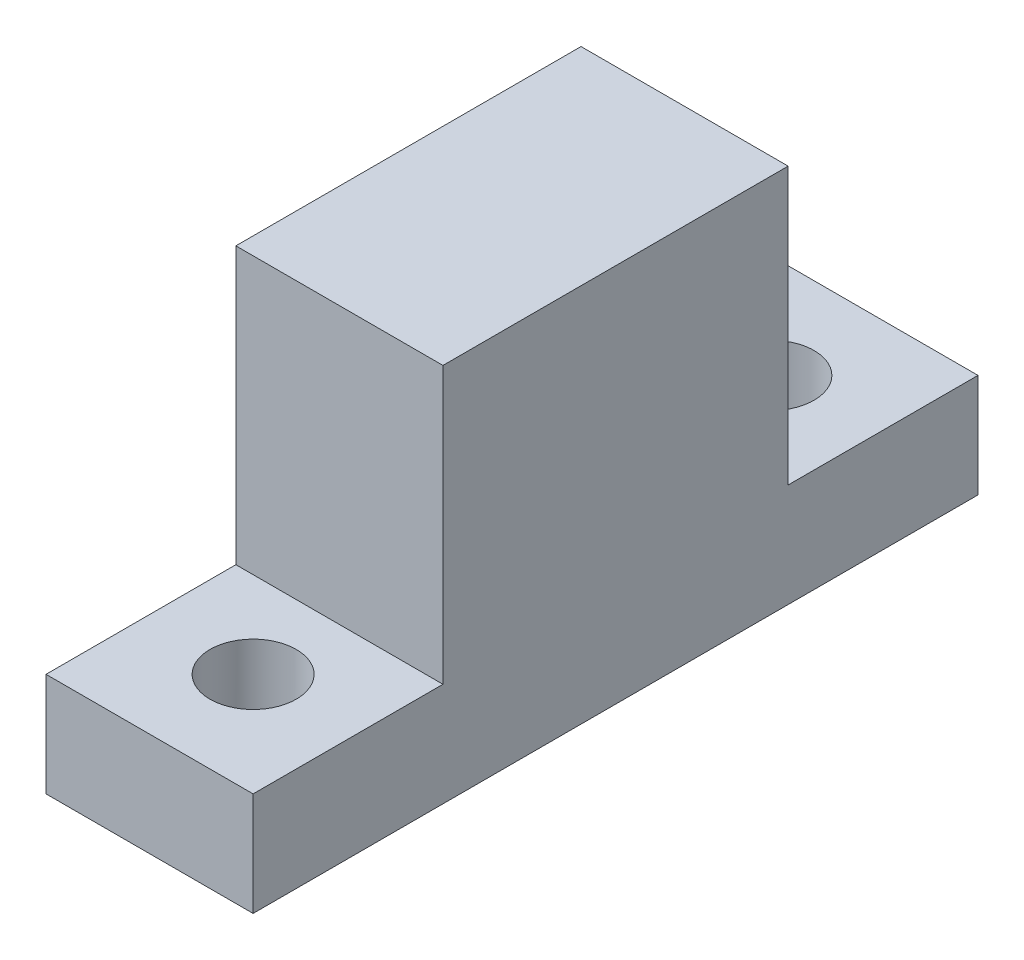
ISO-10303-21;
HEADER;
FILE_DESCRIPTION(('STEP AP214'),'2;1');
FILE_NAME('part.step','',(''),(''),'','','');
FILE_SCHEMA(('AUTOMOTIVE_DESIGN { 1 0 10303 214 1 1 1 1 }'));
ENDSEC;
DATA;
#1=APPLICATION_CONTEXT('core data for automotive mechanical design processes');
#2=APPLICATION_PROTOCOL_DEFINITION('international standard','automotive_design',2000,#1);
#3=PRODUCT_CONTEXT('',#1,'mechanical');
#4=PRODUCT('Part','Part','',(#3));
#5=PRODUCT_RELATED_PRODUCT_CATEGORY('part','',(#4));
#6=PRODUCT_DEFINITION_FORMATION('','',#4);
#7=PRODUCT_DEFINITION_CONTEXT('part definition',#1,'design');
#8=PRODUCT_DEFINITION('design','',#6,#7);
#9=PRODUCT_DEFINITION_SHAPE('','',#8);
#10=(LENGTH_UNIT() NAMED_UNIT(*) SI_UNIT(.MILLI.,.METRE.));
#11=(NAMED_UNIT(*) PLANE_ANGLE_UNIT() SI_UNIT($,.RADIAN.));
#12=(NAMED_UNIT(*) SI_UNIT($,.STERADIAN.) SOLID_ANGLE_UNIT());
#13=UNCERTAINTY_MEASURE_WITH_UNIT(LENGTH_MEASURE(1.E-05),#10,'distance_accuracy_value','');
#14=(GEOMETRIC_REPRESENTATION_CONTEXT(3) GLOBAL_UNCERTAINTY_ASSIGNED_CONTEXT((#13)) GLOBAL_UNIT_ASSIGNED_CONTEXT((#10,
#11,#12)) REPRESENTATION_CONTEXT('',''));
#15=CARTESIAN_POINT('',(0.,0.,0.));
#16=DIRECTION('',(0.,0.,1.));
#17=DIRECTION('',(1.,0.,0.));
#18=AXIS2_PLACEMENT_3D('',#15,#16,#17);
#19=CARTESIAN_POINT('',(0.,3.,0.));
#20=DIRECTION('',(0.,-1.,0.));
#21=DIRECTION('',(0.,0.,-1.));
#22=AXIS2_PLACEMENT_3D('',#19,#20,#21);
#23=PLANE('',#22);
#24=CARTESIAN_POINT('',(3.,3.,-18.));
#25=DIRECTION('',(0.,1.,0.));
#26=DIRECTION('',(0.,0.,1.));
#27=AXIS2_PLACEMENT_3D('',#24,#25,#26);
#28=CIRCLE('',#27,1.25);
#29=CARTESIAN_POINT('',(3.,3.,-16.75));
#30=VERTEX_POINT('',#29);
#31=EDGE_CURVE('E177',#30,#30,#28,.T.);
#32=ORIENTED_EDGE('',*,*,#31,.F.);
#33=EDGE_LOOP('',(#32));
#34=FACE_BOUND('',#33,.T.);
#35=DIRECTION('',(-1.,0.,0.));
#36=VECTOR('',#35,1.);
#37=CARTESIAN_POINT('',(0.,3.,-15.5));
#38=LINE('',#37,#36);
#39=CARTESIAN_POINT('',(6.,3.,-15.5));
#40=VERTEX_POINT('',#39);
#41=CARTESIAN_POINT('',(0.,3.,-15.5));
#42=VERTEX_POINT('',#41);
#43=EDGE_CURVE('E57',#40,#42,#38,.T.);
#44=ORIENTED_EDGE('',*,*,#43,.F.);
#45=DIRECTION('',(0.,0.,-1.));
#46=VECTOR('',#45,1.);
#47=CARTESIAN_POINT('',(6.,3.,0.));
#48=LINE('',#47,#46);
#49=CARTESIAN_POINT('',(6.,3.,-21.));
#50=VERTEX_POINT('',#49);
#51=EDGE_CURVE('E149',#40,#50,#48,.T.);
#52=ORIENTED_EDGE('',*,*,#51,.T.);
#53=DIRECTION('',(-1.,0.,0.));
#54=VECTOR('',#53,1.);
#55=CARTESIAN_POINT('',(0.,3.,-21.));
#56=LINE('',#55,#54);
#57=CARTESIAN_POINT('',(0.,3.,-21.));
#58=VERTEX_POINT('',#57);
#59=EDGE_CURVE('E153',#50,#58,#56,.T.);
#60=ORIENTED_EDGE('',*,*,#59,.T.);
#61=DIRECTION('',(0.,0.,1.));
#62=VECTOR('',#61,1.);
#63=CARTESIAN_POINT('',(0.,3.,0.));
#64=LINE('',#63,#62);
#65=EDGE_CURVE('E143',#58,#42,#64,.T.);
#66=ORIENTED_EDGE('',*,*,#65,.T.);
#67=EDGE_LOOP('',(#44,#52,#60,#66));
#68=FACE_BOUND('',#67,.T.);
#69=ADVANCED_FACE('F39',(#34,#68),#23,.F.);
#70=CARTESIAN_POINT('',(3.,3.,-3.));
#71=DIRECTION('',(0.,1.,0.));
#72=DIRECTION('',(0.,0.,1.));
#73=AXIS2_PLACEMENT_3D('',#70,#71,#72);
#74=CIRCLE('',#73,1.25);
#75=CARTESIAN_POINT('',(3.,3.,-1.75));
#76=VERTEX_POINT('',#75);
#77=EDGE_CURVE('E189',#76,#76,#74,.T.);
#78=ORIENTED_EDGE('',*,*,#77,.F.);
#79=EDGE_LOOP('',(#78));
#80=FACE_BOUND('',#79,.T.);
#81=DIRECTION('',(1.,0.,0.));
#82=VECTOR('',#81,1.);
#83=CARTESIAN_POINT('',(0.,3.,-5.5));
#84=LINE('',#83,#82);
#85=CARTESIAN_POINT('',(0.,3.,-5.5));
#86=VERTEX_POINT('',#85);
#87=CARTESIAN_POINT('',(6.,3.,-5.5));
#88=VERTEX_POINT('',#87);
#89=EDGE_CURVE('E65',#86,#88,#84,.T.);
#90=ORIENTED_EDGE('',*,*,#89,.F.);
#91=CARTESIAN_POINT('',(0.,3.,0.));
#92=VERTEX_POINT('',#91);
#93=EDGE_CURVE('E131',#86,#92,#64,.T.);
#94=ORIENTED_EDGE('',*,*,#93,.T.);
#95=DIRECTION('',(1.,0.,0.));
#96=VECTOR('',#95,1.);
#97=CARTESIAN_POINT('',(0.,3.,0.));
#98=LINE('',#97,#96);
#99=CARTESIAN_POINT('',(6.,3.,0.));
#100=VERTEX_POINT('',#99);
#101=EDGE_CURVE('E146',#92,#100,#98,.T.);
#102=ORIENTED_EDGE('',*,*,#101,.T.);
#103=EDGE_CURVE('E150',#100,#88,#48,.T.);
#104=ORIENTED_EDGE('',*,*,#103,.T.);
#105=EDGE_LOOP('',(#90,#94,#102,#104));
#106=FACE_BOUND('',#105,.T.);
#107=ADVANCED_FACE('F212',(#80,#106),#23,.F.);
#108=CARTESIAN_POINT('',(0.,3.,0.));
#109=DIRECTION('',(1.,0.,0.));
#110=DIRECTION('',(0.,0.,-1.));
#111=AXIS2_PLACEMENT_3D('',#108,#109,#110);
#112=PLANE('',#111);
#113=DIRECTION('',(0.,0.,1.));
#114=VECTOR('',#113,1.);
#115=CARTESIAN_POINT('',(0.,0.,0.));
#116=LINE('',#115,#114);
#117=CARTESIAN_POINT('',(0.,0.,-21.));
#118=VERTEX_POINT('',#117);
#119=CARTESIAN_POINT('',(0.,0.,0.));
#120=VERTEX_POINT('',#119);
#121=EDGE_CURVE('E133',#118,#120,#116,.T.);
#122=ORIENTED_EDGE('',*,*,#121,.T.);
#123=DIRECTION('',(0.,-1.,0.));
#124=VECTOR('',#123,1.);
#125=CARTESIAN_POINT('',(0.,3.,0.));
#126=LINE('',#125,#124);
#127=EDGE_CURVE('E11',#92,#120,#126,.T.);
#128=ORIENTED_EDGE('',*,*,#127,.F.);
#129=ORIENTED_EDGE('',*,*,#93,.F.);
#130=DIRECTION('',(0.,-1.,0.));
#131=VECTOR('',#130,1.);
#132=CARTESIAN_POINT('',(0.,11.,-5.5));
#133=LINE('',#132,#131);
#134=CARTESIAN_POINT('',(0.,11.,-5.5));
#135=VERTEX_POINT('',#134);
#136=EDGE_CURVE('E111',#135,#86,#133,.T.);
#137=ORIENTED_EDGE('',*,*,#136,.F.);
#138=DIRECTION('',(0.,0.,1.));
#139=VECTOR('',#138,1.);
#140=CARTESIAN_POINT('',(0.,11.,-15.5));
#141=LINE('',#140,#139);
#142=CARTESIAN_POINT('',(0.,11.,-15.5));
#143=VERTEX_POINT('',#142);
#144=EDGE_CURVE('E118',#143,#135,#141,.T.);
#145=ORIENTED_EDGE('',*,*,#144,.F.);
#146=DIRECTION('',(0.,-1.,0.));
#147=VECTOR('',#146,1.);
#148=CARTESIAN_POINT('',(0.,11.,-15.5));
#149=LINE('',#148,#147);
#150=EDGE_CURVE('E195',#143,#42,#149,.T.);
#151=ORIENTED_EDGE('',*,*,#150,.T.);
#152=ORIENTED_EDGE('',*,*,#65,.F.);
#153=DIRECTION('',(0.,-1.,0.));
#154=VECTOR('',#153,1.);
#155=CARTESIAN_POINT('',(0.,3.,-21.));
#156=LINE('',#155,#154);
#157=EDGE_CURVE('E155',#58,#118,#156,.T.);
#158=ORIENTED_EDGE('',*,*,#157,.T.);
#159=EDGE_LOOP('',(#122,#128,#129,#137,#145,#151,#152,#158));
#160=FACE_BOUND('',#159,.T.);
#161=ADVANCED_FACE('F41',(#160),#112,.F.);
#162=CARTESIAN_POINT('',(0.,3.,0.));
#163=DIRECTION('',(0.,0.,-1.));
#164=DIRECTION('',(-1.,0.,0.));
#165=AXIS2_PLACEMENT_3D('',#162,#163,#164);
#166=PLANE('',#165);
#167=DIRECTION('',(1.,0.,0.));
#168=VECTOR('',#167,1.);
#169=CARTESIAN_POINT('',(0.,0.,0.));
#170=LINE('',#169,#168);
#171=CARTESIAN_POINT('',(6.,0.,0.));
#172=VERTEX_POINT('',#171);
#173=EDGE_CURVE('E137',#120,#172,#170,.T.);
#174=ORIENTED_EDGE('',*,*,#173,.T.);
#175=DIRECTION('',(0.,-1.,0.));
#176=VECTOR('',#175,1.);
#177=CARTESIAN_POINT('',(6.,3.,0.));
#178=LINE('',#177,#176);
#179=EDGE_CURVE('E49',#100,#172,#178,.T.);
#180=ORIENTED_EDGE('',*,*,#179,.F.);
#181=ORIENTED_EDGE('',*,*,#101,.F.);
#182=ORIENTED_EDGE('',*,*,#127,.T.);
#183=EDGE_LOOP('',(#174,#180,#181,#182));
#184=FACE_BOUND('',#183,.T.);
#185=ADVANCED_FACE('F215',(#184),#166,.F.);
#186=CARTESIAN_POINT('',(6.,3.,0.));
#187=DIRECTION('',(-1.,0.,0.));
#188=DIRECTION('',(0.,0.,1.));
#189=AXIS2_PLACEMENT_3D('',#186,#187,#188);
#190=PLANE('',#189);
#191=DIRECTION('',(0.,0.,-1.));
#192=VECTOR('',#191,1.);
#193=CARTESIAN_POINT('',(6.,0.,0.));
#194=LINE('',#193,#192);
#195=CARTESIAN_POINT('',(6.,0.,-21.));
#196=VERTEX_POINT('',#195);
#197=EDGE_CURVE('E159',#172,#196,#194,.T.);
#198=ORIENTED_EDGE('',*,*,#197,.T.);
#199=DIRECTION('',(0.,-1.,0.));
#200=VECTOR('',#199,1.);
#201=CARTESIAN_POINT('',(6.,3.,-21.));
#202=LINE('',#201,#200);
#203=EDGE_CURVE('E168',#50,#196,#202,.T.);
#204=ORIENTED_EDGE('',*,*,#203,.F.);
#205=ORIENTED_EDGE('',*,*,#51,.F.);
#206=DIRECTION('',(0.,-1.,0.));
#207=VECTOR('',#206,1.);
#208=CARTESIAN_POINT('',(6.,11.,-15.5));
#209=LINE('',#208,#207);
#210=CARTESIAN_POINT('',(6.,11.,-15.5));
#211=VERTEX_POINT('',#210);
#212=EDGE_CURVE('E139',#211,#40,#209,.T.);
#213=ORIENTED_EDGE('',*,*,#212,.F.);
#214=DIRECTION('',(0.,0.,-1.));
#215=VECTOR('',#214,1.);
#216=CARTESIAN_POINT('',(6.,11.,-15.5));
#217=LINE('',#216,#215);
#218=CARTESIAN_POINT('',(6.,11.,-5.5));
#219=VERTEX_POINT('',#218);
#220=EDGE_CURVE('E117',#219,#211,#217,.T.);
#221=ORIENTED_EDGE('',*,*,#220,.F.);
#222=DIRECTION('',(0.,-1.,0.));
#223=VECTOR('',#222,1.);
#224=CARTESIAN_POINT('',(6.,11.,-5.5));
#225=LINE('',#224,#223);
#226=EDGE_CURVE('E113',#219,#88,#225,.T.);
#227=ORIENTED_EDGE('',*,*,#226,.T.);
#228=ORIENTED_EDGE('',*,*,#103,.F.);
#229=ORIENTED_EDGE('',*,*,#179,.T.);
#230=EDGE_LOOP('',(#198,#204,#205,#213,#221,#227,#228,#229));
#231=FACE_BOUND('',#230,.T.);
#232=ADVANCED_FACE('F206',(#231),#190,.F.);
#233=CARTESIAN_POINT('',(0.,3.,-21.));
#234=DIRECTION('',(0.,0.,1.));
#235=DIRECTION('',(1.,0.,0.));
#236=AXIS2_PLACEMENT_3D('',#233,#234,#235);
#237=PLANE('',#236);
#238=DIRECTION('',(-1.,0.,0.));
#239=VECTOR('',#238,1.);
#240=CARTESIAN_POINT('',(0.,0.,-21.));
#241=LINE('',#240,#239);
#242=EDGE_CURVE('E162',#196,#118,#241,.T.);
#243=ORIENTED_EDGE('',*,*,#242,.T.);
#244=ORIENTED_EDGE('',*,*,#157,.F.);
#245=ORIENTED_EDGE('',*,*,#59,.F.);
#246=ORIENTED_EDGE('',*,*,#203,.T.);
#247=EDGE_LOOP('',(#243,#244,#245,#246));
#248=FACE_BOUND('',#247,.T.);
#249=ADVANCED_FACE('F225',(#248),#237,.F.);
#250=CARTESIAN_POINT('',(0.,0.,0.));
#251=DIRECTION('',(0.,-1.,0.));
#252=DIRECTION('',(0.,0.,-1.));
#253=AXIS2_PLACEMENT_3D('',#250,#251,#252);
#254=PLANE('',#253);
#255=CARTESIAN_POINT('',(3.,0.,-3.));
#256=DIRECTION('',(0.,-1.,0.));
#257=DIRECTION('',(0.,0.,-1.));
#258=AXIS2_PLACEMENT_3D('',#255,#256,#257);
#259=CIRCLE('',#258,1.25);
#260=CARTESIAN_POINT('',(3.,0.,-4.25));
#261=VERTEX_POINT('',#260);
#262=EDGE_CURVE('E43',#261,#261,#259,.T.);
#263=ORIENTED_EDGE('',*,*,#262,.F.);
#264=EDGE_LOOP('',(#263));
#265=FACE_BOUND('',#264,.T.);
#266=CARTESIAN_POINT('',(3.,0.,-18.));
#267=DIRECTION('',(0.,-1.,0.));
#268=DIRECTION('',(0.,0.,-1.));
#269=AXIS2_PLACEMENT_3D('',#266,#267,#268);
#270=CIRCLE('',#269,1.25);
#271=CARTESIAN_POINT('',(3.,0.,-19.25));
#272=VERTEX_POINT('',#271);
#273=EDGE_CURVE('E174',#272,#272,#270,.T.);
#274=ORIENTED_EDGE('',*,*,#273,.F.);
#275=EDGE_LOOP('',(#274));
#276=FACE_BOUND('',#275,.T.);
#277=ORIENTED_EDGE('',*,*,#121,.F.);
#278=ORIENTED_EDGE('',*,*,#242,.F.);
#279=ORIENTED_EDGE('',*,*,#197,.F.);
#280=ORIENTED_EDGE('',*,*,#173,.F.);
#281=EDGE_LOOP('',(#277,#278,#279,#280));
#282=FACE_BOUND('',#281,.T.);
#283=ADVANCED_FACE('F222',(#265,#276,#282),#254,.T.);
#284=CARTESIAN_POINT('',(0.,11.,-5.5));
#285=DIRECTION('',(0.,0.,-1.));
#286=DIRECTION('',(-1.,0.,0.));
#287=AXIS2_PLACEMENT_3D('',#284,#285,#286);
#288=PLANE('',#287);
#289=ORIENTED_EDGE('',*,*,#89,.T.);
#290=ORIENTED_EDGE('',*,*,#226,.F.);
#291=DIRECTION('',(1.,0.,0.));
#292=VECTOR('',#291,1.);
#293=CARTESIAN_POINT('',(0.,11.,-5.5));
#294=LINE('',#293,#292);
#295=EDGE_CURVE('E107',#135,#219,#294,.T.);
#296=ORIENTED_EDGE('',*,*,#295,.F.);
#297=ORIENTED_EDGE('',*,*,#136,.T.);
#298=EDGE_LOOP('',(#289,#290,#296,#297));
#299=FACE_BOUND('',#298,.T.);
#300=ADVANCED_FACE('F109',(#299),#288,.F.);
#301=CARTESIAN_POINT('',(0.,11.,-15.5));
#302=DIRECTION('',(0.,0.,1.));
#303=DIRECTION('',(1.,0.,0.));
#304=AXIS2_PLACEMENT_3D('',#301,#302,#303);
#305=PLANE('',#304);
#306=ORIENTED_EDGE('',*,*,#43,.T.);
#307=ORIENTED_EDGE('',*,*,#150,.F.);
#308=DIRECTION('',(-1.,0.,0.));
#309=VECTOR('',#308,1.);
#310=CARTESIAN_POINT('',(0.,11.,-15.5));
#311=LINE('',#310,#309);
#312=EDGE_CURVE('E123',#211,#143,#311,.T.);
#313=ORIENTED_EDGE('',*,*,#312,.F.);
#314=ORIENTED_EDGE('',*,*,#212,.T.);
#315=EDGE_LOOP('',(#306,#307,#313,#314));
#316=FACE_BOUND('',#315,.T.);
#317=ADVANCED_FACE('F204',(#316),#305,.F.);
#318=CARTESIAN_POINT('',(0.,11.,0.));
#319=DIRECTION('',(0.,1.,0.));
#320=DIRECTION('',(0.,0.,1.));
#321=AXIS2_PLACEMENT_3D('',#318,#319,#320);
#322=PLANE('',#321);
#323=ORIENTED_EDGE('',*,*,#144,.T.);
#324=ORIENTED_EDGE('',*,*,#295,.T.);
#325=ORIENTED_EDGE('',*,*,#220,.T.);
#326=ORIENTED_EDGE('',*,*,#312,.T.);
#327=EDGE_LOOP('',(#323,#324,#325,#326));
#328=FACE_BOUND('',#327,.T.);
#329=ADVANCED_FACE('F121',(#328),#322,.T.);
#330=CARTESIAN_POINT('',(3.,-3.,-18.));
#331=DIRECTION('',(0.,1.,0.));
#332=DIRECTION('',(0.,0.,1.));
#333=AXIS2_PLACEMENT_3D('',#330,#331,#332);
#334=CYLINDRICAL_SURFACE('',#333,1.25);
#335=ORIENTED_EDGE('',*,*,#273,.T.);
#336=EDGE_LOOP('',(#335));
#337=FACE_BOUND('',#336,.T.);
#338=ORIENTED_EDGE('',*,*,#31,.T.);
#339=EDGE_LOOP('',(#338));
#340=FACE_BOUND('',#339,.T.);
#341=ADVANCED_FACE('F262',(#337,#340),#334,.F.);
#342=CARTESIAN_POINT('',(3.,-3.,-3.));
#343=DIRECTION('',(0.,1.,0.));
#344=DIRECTION('',(0.,0.,1.));
#345=AXIS2_PLACEMENT_3D('',#342,#343,#344);
#346=CYLINDRICAL_SURFACE('',#345,1.25);
#347=ORIENTED_EDGE('',*,*,#262,.T.);
#348=EDGE_LOOP('',(#347));
#349=FACE_BOUND('',#348,.T.);
#350=ORIENTED_EDGE('',*,*,#77,.T.);
#351=EDGE_LOOP('',(#350));
#352=FACE_BOUND('',#351,.T.);
#353=ADVANCED_FACE('F273',(#349,#352),#346,.F.);
#354=CLOSED_SHELL('',(#69,#107,#161,#185,#232,#249,#283,#300,#317,#329,#341,#353));
#355=MANIFOLD_SOLID_BREP('B2',#354);
#356=ADVANCED_BREP_SHAPE_REPRESENTATION('',(#18,#355),#14);
#357=SHAPE_DEFINITION_REPRESENTATION(#9,#356);
ENDSEC;
END-ISO-10303-21;
